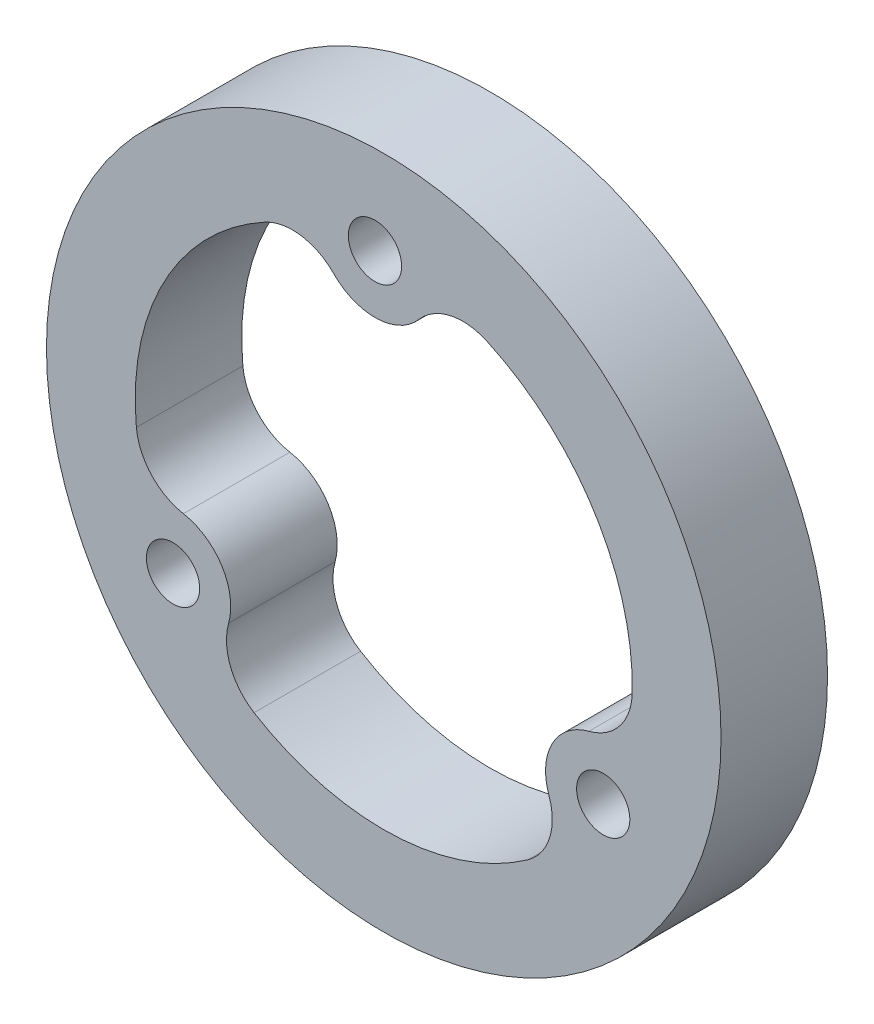
ISO-10303-21;
HEADER;
FILE_DESCRIPTION(('STEP AP214'),'2;1');
FILE_NAME('part.step','',(''),(''),'','','');
FILE_SCHEMA(('AUTOMOTIVE_DESIGN { 1 0 10303 214 1 1 1 1 }'));
ENDSEC;
DATA;
#1=APPLICATION_CONTEXT('core data for automotive mechanical design processes');
#2=APPLICATION_PROTOCOL_DEFINITION('international standard','automotive_design',2000,#1);
#3=PRODUCT_CONTEXT('',#1,'mechanical');
#4=PRODUCT('Part','Part','',(#3));
#5=PRODUCT_RELATED_PRODUCT_CATEGORY('part','',(#4));
#6=PRODUCT_DEFINITION_FORMATION('','',#4);
#7=PRODUCT_DEFINITION_CONTEXT('part definition',#1,'design');
#8=PRODUCT_DEFINITION('design','',#6,#7);
#9=PRODUCT_DEFINITION_SHAPE('','',#8);
#10=(LENGTH_UNIT() NAMED_UNIT(*) SI_UNIT(.MILLI.,.METRE.));
#11=(NAMED_UNIT(*) PLANE_ANGLE_UNIT() SI_UNIT($,.RADIAN.));
#12=(NAMED_UNIT(*) SI_UNIT($,.STERADIAN.) SOLID_ANGLE_UNIT());
#13=UNCERTAINTY_MEASURE_WITH_UNIT(LENGTH_MEASURE(1.E-05),#10,'distance_accuracy_value','');
#14=(GEOMETRIC_REPRESENTATION_CONTEXT(3) GLOBAL_UNCERTAINTY_ASSIGNED_CONTEXT((#13)) GLOBAL_UNIT_ASSIGNED_CONTEXT((#10,
#11,#12)) REPRESENTATION_CONTEXT('',''));
#15=CARTESIAN_POINT('',(0.,0.,0.));
#16=DIRECTION('',(0.,0.,1.));
#17=DIRECTION('',(1.,0.,0.));
#18=AXIS2_PLACEMENT_3D('',#15,#16,#17);
#19=CARTESIAN_POINT('',(0.,0.,6.));
#20=DIRECTION('',(0.,0.,1.));
#21=DIRECTION('',(1.,0.,0.));
#22=AXIS2_PLACEMENT_3D('',#19,#20,#21);
#23=PLANE('',#22);
#24=CARTESIAN_POINT('',(0.,0.,6.));
#25=DIRECTION('',(0.,0.,1.));
#26=DIRECTION('',(1.,0.,0.));
#27=AXIS2_PLACEMENT_3D('',#24,#25,#26);
#28=CIRCLE('',#27,14.);
#29=CARTESIAN_POINT('',(13.9955052642864,-0.354728624911595,6.));
#30=VERTEX_POINT('',#29);
#31=CARTESIAN_POINT('',(5.80690829075814,12.7389095335011,6.));
#32=VERTEX_POINT('',#31);
#33=EDGE_CURVE('E129',#30,#32,#28,.T.);
#34=ORIENTED_EDGE('',*,*,#33,.F.);
#35=CARTESIAN_POINT('',(10.7465486850771,-0.272380908414255,6.));
#36=DIRECTION('',(0.,0.,1.));
#37=DIRECTION('',(1.,0.,0.));
#38=AXIS2_PLACEMENT_3D('',#35,#36,#37);
#39=CIRCLE('',#38,3.25);
#40=CARTESIAN_POINT('',(11.5551312818012,-3.42018874630315,6.));
#41=VERTEX_POINT('',#40);
#42=EDGE_CURVE('E121',#41,#30,#39,.T.);
#43=ORIENTED_EDGE('',*,*,#42,.F.);
#44=CARTESIAN_POINT('',(12.3637138785254,-6.56799658419206,6.));
#45=DIRECTION('',(0.,0.,-1.));
#46=DIRECTION('',(1.,0.,0.));
#47=AXIS2_PLACEMENT_3D('',#44,#45,#46);
#48=CIRCLE('',#47,3.25);
#49=CARTESIAN_POINT('',(9.30272212200573,-7.66016390952212,6.));
#50=VERTEX_POINT('',#49);
#51=EDGE_CURVE('E164',#50,#41,#48,.T.);
#52=ORIENTED_EDGE('',*,*,#51,.F.);
#53=CARTESIAN_POINT('',(6.24173036548606,-8.75233123485219,6.));
#54=DIRECTION('',(0.,0.,1.));
#55=DIRECTION('',(1.,0.,0.));
#56=AXIS2_PLACEMENT_3D('',#53,#54,#55);
#57=CIRCLE('',#56,3.25);
#58=CARTESIAN_POINT('',(8.12876512714463,-11.3983848639936,6.));
#59=VERTEX_POINT('',#58);
#60=EDGE_CURVE('E162',#59,#50,#57,.T.);
#61=ORIENTED_EDGE('',*,*,#60,.F.);
#62=CARTESIAN_POINT('',(0.,0.,6.));
#63=DIRECTION('',(0.,0.,1.));
#64=DIRECTION('',(1.,0.,0.));
#65=AXIS2_PLACEMENT_3D('',#62,#63,#64);
#66=CIRCLE('',#65,14.);
#67=CARTESIAN_POINT('',(-7.30495663276615,-11.9430987852151,6.));
#68=VERTEX_POINT('',#67);
#69=EDGE_CURVE('E160',#68,#59,#66,.T.);
#70=ORIENTED_EDGE('',*,*,#69,.F.);
#71=CARTESIAN_POINT('',(-5.60916312873115,-9.17059371007586,6.));
#72=DIRECTION('',(0.,0.,1.));
#73=DIRECTION('',(1.,0.,0.));
#74=AXIS2_PLACEMENT_3D('',#71,#72,#73);
#75=CIRCLE('',#74,3.25);
#76=CARTESIAN_POINT('',(-8.73953598093679,-8.29694286095253,6.));
#77=VERTEX_POINT('',#76);
#78=EDGE_CURVE('E158',#77,#68,#75,.T.);
#79=ORIENTED_EDGE('',*,*,#78,.F.);
#80=CARTESIAN_POINT('',(-11.8699088331424,-7.4232920118292,6.));
#81=DIRECTION('',(0.,0.,-1.));
#82=DIRECTION('',(1.,0.,0.));
#83=AXIS2_PLACEMENT_3D('',#80,#81,#82);
#84=CIRCLE('',#83,3.25);
#85=CARTESIAN_POINT('',(-11.2852576038017,-4.22631172724338,6.));
#86=VERTEX_POINT('',#85);
#87=EDGE_CURVE('E156',#86,#77,#84,.T.);
#88=ORIENTED_EDGE('',*,*,#87,.F.);
#89=CARTESIAN_POINT('',(-10.7006063744611,-1.02933144265756,6.));
#90=DIRECTION('',(0.,0.,1.));
#91=DIRECTION('',(1.,0.,0.));
#92=AXIS2_PLACEMENT_3D('',#89,#90,#91);
#93=CIRCLE('',#92,3.25);
#94=CARTESIAN_POINT('',(-13.9356734179028,-1.34052466950752,6.));
#95=VERTEX_POINT('',#94);
#96=EDGE_CURVE('E154',#95,#86,#93,.T.);
#97=ORIENTED_EDGE('',*,*,#96,.F.);
#98=CARTESIAN_POINT('',(0.,0.,6.));
#99=DIRECTION('',(0.,0.,1.));
#100=DIRECTION('',(1.,0.,0.));
#101=AXIS2_PLACEMENT_3D('',#98,#99,#100);
#102=CIRCLE('',#101,14.);
#103=CARTESIAN_POINT('',(-6.69054863152024,12.2978274101267,6.));
#104=VERTEX_POINT('',#103);
#105=EDGE_CURVE('E152',#104,#95,#102,.T.);
#106=ORIENTED_EDGE('',*,*,#105,.F.);
#107=CARTESIAN_POINT('',(-5.1373855563459,9.44297461849011,6.));
#108=DIRECTION('',(0.,0.,1.));
#109=DIRECTION('',(1.,0.,0.));
#110=AXIS2_PLACEMENT_3D('',#107,#108,#109);
#111=CIRCLE('',#110,3.25);
#112=CARTESIAN_POINT('',(-2.81559530086442,11.7171316072557,6.));
#113=VERTEX_POINT('',#112);
#114=EDGE_CURVE('E150',#113,#104,#111,.T.);
#115=ORIENTED_EDGE('',*,*,#114,.F.);
#116=CARTESIAN_POINT('',(-0.493805045382954,13.9912885960213,6.));
#117=DIRECTION('',(0.,0.,-1.));
#118=DIRECTION('',(1.,0.,0.));
#119=AXIS2_PLACEMENT_3D('',#116,#117,#118);
#120=CIRCLE('',#119,3.25);
#121=CARTESIAN_POINT('',(1.98253548179602,11.8864756367655,6.));
#122=VERTEX_POINT('',#121);
#123=EDGE_CURVE('E145',#122,#113,#120,.T.);
#124=ORIENTED_EDGE('',*,*,#123,.F.);
#125=CARTESIAN_POINT('',(4.458876008975,9.78166267750975,6.));
#126=DIRECTION('',(0.,0.,1.));
#127=DIRECTION('',(1.,0.,0.));
#128=AXIS2_PLACEMENT_3D('',#125,#126,#127);
#129=CIRCLE('',#128,3.25);
#130=EDGE_CURVE('E143',#32,#122,#129,.T.);
#131=ORIENTED_EDGE('',*,*,#130,.F.);
#132=EDGE_LOOP('',(#34,#43,#52,#61,#70,#79,#88,#97,#106,#115,#124,#131));
#133=FACE_BOUND('',#132,.T.);
#134=CARTESIAN_POINT('',(12.3637138785254,-6.56799658419206,6.));
#135=DIRECTION('',(0.,0.,1.));
#136=DIRECTION('',(1.,0.,0.));
#137=AXIS2_PLACEMENT_3D('',#134,#135,#136);
#138=CIRCLE('',#137,1.50000000000007);
#139=CARTESIAN_POINT('',(13.8637138785255,-6.56799658419206,6.));
#140=VERTEX_POINT('',#139);
#141=EDGE_CURVE('E217',#140,#140,#138,.T.);
#142=ORIENTED_EDGE('',*,*,#141,.F.);
#143=EDGE_LOOP('',(#142));
#144=FACE_BOUND('',#143,.T.);
#145=CARTESIAN_POINT('',(0.,0.,6.));
#146=DIRECTION('',(0.,0.,1.));
#147=DIRECTION('',(1.,0.,0.));
#148=AXIS2_PLACEMENT_3D('',#145,#146,#147);
#149=CIRCLE('',#148,19.);
#150=CARTESIAN_POINT('',(19.,0.,6.));
#151=VERTEX_POINT('',#150);
#152=EDGE_CURVE('E11',#151,#151,#149,.T.);
#153=ORIENTED_EDGE('',*,*,#152,.T.);
#154=EDGE_LOOP('',(#153));
#155=FACE_BOUND('',#154,.T.);
#156=CARTESIAN_POINT('',(-0.493805045382954,13.9912885960213,6.));
#157=DIRECTION('',(0.,0.,1.));
#158=DIRECTION('',(1.,0.,0.));
#159=AXIS2_PLACEMENT_3D('',#156,#157,#158);
#160=CIRCLE('',#159,1.5);
#161=CARTESIAN_POINT('',(1.00619495461705,13.9912885960213,6.));
#162=VERTEX_POINT('',#161);
#163=EDGE_CURVE('E223',#162,#162,#160,.T.);
#164=ORIENTED_EDGE('',*,*,#163,.F.);
#165=EDGE_LOOP('',(#164));
#166=FACE_BOUND('',#165,.T.);
#167=CARTESIAN_POINT('',(-11.8699088331424,-7.4232920118292,6.));
#168=DIRECTION('',(0.,0.,1.));
#169=DIRECTION('',(1.,0.,0.));
#170=AXIS2_PLACEMENT_3D('',#167,#168,#169);
#171=CIRCLE('',#170,1.50000000000014);
#172=CARTESIAN_POINT('',(-10.3699088331423,-7.4232920118292,6.));
#173=VERTEX_POINT('',#172);
#174=EDGE_CURVE('E167',#173,#173,#171,.T.);
#175=ORIENTED_EDGE('',*,*,#174,.F.);
#176=EDGE_LOOP('',(#175));
#177=FACE_BOUND('',#176,.T.);
#178=ADVANCED_FACE('F32',(#133,#144,#155,#166,#177),#23,.T.);
#179=CARTESIAN_POINT('',(0.,0.,0.));
#180=DIRECTION('',(0.,0.,1.));
#181=DIRECTION('',(1.,0.,0.));
#182=AXIS2_PLACEMENT_3D('',#179,#180,#181);
#183=PLANE('',#182);
#184=CARTESIAN_POINT('',(12.3637138785254,-6.56799658419206,0.));
#185=DIRECTION('',(0.,0.,1.));
#186=DIRECTION('',(1.,0.,0.));
#187=AXIS2_PLACEMENT_3D('',#184,#185,#186);
#188=CIRCLE('',#187,1.50000000000007);
#189=CARTESIAN_POINT('',(13.8637138785255,-6.56799658419206,0.));
#190=VERTEX_POINT('',#189);
#191=EDGE_CURVE('E137',#190,#190,#188,.T.);
#192=ORIENTED_EDGE('',*,*,#191,.T.);
#193=EDGE_LOOP('',(#192));
#194=FACE_BOUND('',#193,.T.);
#195=CARTESIAN_POINT('',(-0.493805045382954,13.9912885960213,0.));
#196=DIRECTION('',(0.,0.,1.));
#197=DIRECTION('',(1.,0.,0.));
#198=AXIS2_PLACEMENT_3D('',#195,#196,#197);
#199=CIRCLE('',#198,1.5);
#200=CARTESIAN_POINT('',(1.00619495461705,13.9912885960213,0.));
#201=VERTEX_POINT('',#200);
#202=EDGE_CURVE('E220',#201,#201,#199,.T.);
#203=ORIENTED_EDGE('',*,*,#202,.T.);
#204=EDGE_LOOP('',(#203));
#205=FACE_BOUND('',#204,.T.);
#206=CARTESIAN_POINT('',(0.,0.,0.));
#207=DIRECTION('',(0.,0.,1.));
#208=DIRECTION('',(1.,0.,0.));
#209=AXIS2_PLACEMENT_3D('',#206,#207,#208);
#210=CIRCLE('',#209,19.);
#211=CARTESIAN_POINT('',(19.,0.,0.));
#212=VERTEX_POINT('',#211);
#213=EDGE_CURVE('E36',#212,#212,#210,.T.);
#214=ORIENTED_EDGE('',*,*,#213,.F.);
#215=EDGE_LOOP('',(#214));
#216=FACE_BOUND('',#215,.T.);
#217=CARTESIAN_POINT('',(10.7465486850771,-0.272380908414255,0.));
#218=DIRECTION('',(0.,0.,1.));
#219=DIRECTION('',(1.,0.,0.));
#220=AXIS2_PLACEMENT_3D('',#217,#218,#219);
#221=CIRCLE('',#220,3.25);
#222=CARTESIAN_POINT('',(11.5551312818012,-3.42018874630315,0.));
#223=VERTEX_POINT('',#222);
#224=CARTESIAN_POINT('',(13.9955052642864,-0.354728624911595,0.));
#225=VERTEX_POINT('',#224);
#226=EDGE_CURVE('E55',#223,#225,#221,.T.);
#227=ORIENTED_EDGE('',*,*,#226,.T.);
#228=CARTESIAN_POINT('',(0.,0.,0.));
#229=DIRECTION('',(0.,0.,1.));
#230=DIRECTION('',(1.,0.,0.));
#231=AXIS2_PLACEMENT_3D('',#228,#229,#230);
#232=CIRCLE('',#231,14.);
#233=CARTESIAN_POINT('',(5.80690829075814,12.7389095335011,0.));
#234=VERTEX_POINT('',#233);
#235=EDGE_CURVE('E136',#225,#234,#232,.T.);
#236=ORIENTED_EDGE('',*,*,#235,.T.);
#237=CARTESIAN_POINT('',(4.458876008975,9.78166267750975,0.));
#238=DIRECTION('',(0.,0.,1.));
#239=DIRECTION('',(1.,0.,0.));
#240=AXIS2_PLACEMENT_3D('',#237,#238,#239);
#241=CIRCLE('',#240,3.25);
#242=CARTESIAN_POINT('',(1.98253548179602,11.8864756367655,0.));
#243=VERTEX_POINT('',#242);
#244=EDGE_CURVE('E169',#234,#243,#241,.T.);
#245=ORIENTED_EDGE('',*,*,#244,.T.);
#246=CARTESIAN_POINT('',(-0.493805045382954,13.9912885960213,0.));
#247=DIRECTION('',(0.,0.,-1.));
#248=DIRECTION('',(1.,0.,0.));
#249=AXIS2_PLACEMENT_3D('',#246,#247,#248);
#250=CIRCLE('',#249,3.25);
#251=CARTESIAN_POINT('',(-2.81559530086442,11.7171316072557,0.));
#252=VERTEX_POINT('',#251);
#253=EDGE_CURVE('E172',#243,#252,#250,.T.);
#254=ORIENTED_EDGE('',*,*,#253,.T.);
#255=CARTESIAN_POINT('',(-5.1373855563459,9.44297461849011,0.));
#256=DIRECTION('',(0.,0.,1.));
#257=DIRECTION('',(1.,0.,0.));
#258=AXIS2_PLACEMENT_3D('',#255,#256,#257);
#259=CIRCLE('',#258,3.25);
#260=CARTESIAN_POINT('',(-6.69054863152024,12.2978274101267,0.));
#261=VERTEX_POINT('',#260);
#262=EDGE_CURVE('E175',#252,#261,#259,.T.);
#263=ORIENTED_EDGE('',*,*,#262,.T.);
#264=CARTESIAN_POINT('',(0.,0.,0.));
#265=DIRECTION('',(0.,0.,1.));
#266=DIRECTION('',(1.,0.,0.));
#267=AXIS2_PLACEMENT_3D('',#264,#265,#266);
#268=CIRCLE('',#267,14.);
#269=CARTESIAN_POINT('',(-13.9356734179028,-1.34052466950752,0.));
#270=VERTEX_POINT('',#269);
#271=EDGE_CURVE('E178',#261,#270,#268,.T.);
#272=ORIENTED_EDGE('',*,*,#271,.T.);
#273=CARTESIAN_POINT('',(-10.7006063744611,-1.02933144265756,0.));
#274=DIRECTION('',(0.,0.,1.));
#275=DIRECTION('',(1.,0.,0.));
#276=AXIS2_PLACEMENT_3D('',#273,#274,#275);
#277=CIRCLE('',#276,3.25);
#278=CARTESIAN_POINT('',(-11.2852576038017,-4.22631172724338,0.));
#279=VERTEX_POINT('',#278);
#280=EDGE_CURVE('E181',#270,#279,#277,.T.);
#281=ORIENTED_EDGE('',*,*,#280,.T.);
#282=CARTESIAN_POINT('',(-11.8699088331424,-7.4232920118292,0.));
#283=DIRECTION('',(0.,0.,-1.));
#284=DIRECTION('',(1.,0.,0.));
#285=AXIS2_PLACEMENT_3D('',#282,#283,#284);
#286=CIRCLE('',#285,3.25);
#287=CARTESIAN_POINT('',(-8.73953598093679,-8.29694286095253,0.));
#288=VERTEX_POINT('',#287);
#289=EDGE_CURVE('E184',#279,#288,#286,.T.);
#290=ORIENTED_EDGE('',*,*,#289,.T.);
#291=CARTESIAN_POINT('',(-5.60916312873115,-9.17059371007586,0.));
#292=DIRECTION('',(0.,0.,1.));
#293=DIRECTION('',(1.,0.,0.));
#294=AXIS2_PLACEMENT_3D('',#291,#292,#293);
#295=CIRCLE('',#294,3.25);
#296=CARTESIAN_POINT('',(-7.30495663276615,-11.9430987852151,0.));
#297=VERTEX_POINT('',#296);
#298=EDGE_CURVE('E187',#288,#297,#295,.T.);
#299=ORIENTED_EDGE('',*,*,#298,.T.);
#300=CARTESIAN_POINT('',(0.,0.,0.));
#301=DIRECTION('',(0.,0.,1.));
#302=DIRECTION('',(1.,0.,0.));
#303=AXIS2_PLACEMENT_3D('',#300,#301,#302);
#304=CIRCLE('',#303,14.);
#305=CARTESIAN_POINT('',(8.12876512714463,-11.3983848639936,0.));
#306=VERTEX_POINT('',#305);
#307=EDGE_CURVE('E190',#297,#306,#304,.T.);
#308=ORIENTED_EDGE('',*,*,#307,.T.);
#309=CARTESIAN_POINT('',(6.24173036548606,-8.75233123485219,0.));
#310=DIRECTION('',(0.,0.,1.));
#311=DIRECTION('',(1.,0.,0.));
#312=AXIS2_PLACEMENT_3D('',#309,#310,#311);
#313=CIRCLE('',#312,3.25);
#314=CARTESIAN_POINT('',(9.30272212200573,-7.66016390952212,0.));
#315=VERTEX_POINT('',#314);
#316=EDGE_CURVE('E193',#306,#315,#313,.T.);
#317=ORIENTED_EDGE('',*,*,#316,.T.);
#318=CARTESIAN_POINT('',(12.3637138785254,-6.56799658419206,0.));
#319=DIRECTION('',(0.,0.,-1.));
#320=DIRECTION('',(1.,0.,0.));
#321=AXIS2_PLACEMENT_3D('',#318,#319,#320);
#322=CIRCLE('',#321,3.25);
#323=EDGE_CURVE('E130',#315,#223,#322,.T.);
#324=ORIENTED_EDGE('',*,*,#323,.T.);
#325=EDGE_LOOP('',(#227,#236,#245,#254,#263,#272,#281,#290,#299,#308,#317,#324));
#326=FACE_BOUND('',#325,.T.);
#327=CARTESIAN_POINT('',(-11.8699088331424,-7.4232920118292,0.));
#328=DIRECTION('',(0.,0.,1.));
#329=DIRECTION('',(1.,0.,0.));
#330=AXIS2_PLACEMENT_3D('',#327,#328,#329);
#331=CIRCLE('',#330,1.50000000000014);
#332=CARTESIAN_POINT('',(-10.3699088331423,-7.4232920118292,0.));
#333=VERTEX_POINT('',#332);
#334=EDGE_CURVE('E402',#333,#333,#331,.T.);
#335=ORIENTED_EDGE('',*,*,#334,.T.);
#336=EDGE_LOOP('',(#335));
#337=FACE_BOUND('',#336,.T.);
#338=ADVANCED_FACE('F229',(#194,#205,#216,#326,#337),#183,.F.);
#339=CARTESIAN_POINT('',(0.,0.,6.));
#340=DIRECTION('',(0.,0.,-1.));
#341=DIRECTION('',(-1.,0.,0.));
#342=AXIS2_PLACEMENT_3D('',#339,#340,#341);
#343=CYLINDRICAL_SURFACE('',#342,19.);
#344=ORIENTED_EDGE('',*,*,#152,.F.);
#345=EDGE_LOOP('',(#344));
#346=FACE_BOUND('',#345,.T.);
#347=ORIENTED_EDGE('',*,*,#213,.T.);
#348=EDGE_LOOP('',(#347));
#349=FACE_BOUND('',#348,.T.);
#350=ADVANCED_FACE('F34',(#346,#349),#343,.T.);
#351=CARTESIAN_POINT('',(-0.493805045382954,13.9912885960213,6.));
#352=DIRECTION('',(0.,0.,-1.));
#353=DIRECTION('',(-1.,0.,0.));
#354=AXIS2_PLACEMENT_3D('',#351,#352,#353);
#355=CYLINDRICAL_SURFACE('',#354,1.5);
#356=ORIENTED_EDGE('',*,*,#163,.T.);
#357=EDGE_LOOP('',(#356));
#358=FACE_BOUND('',#357,.T.);
#359=ORIENTED_EDGE('',*,*,#202,.F.);
#360=EDGE_LOOP('',(#359));
#361=FACE_BOUND('',#360,.T.);
#362=ADVANCED_FACE('F232',(#358,#361),#355,.F.);
#363=CARTESIAN_POINT('',(12.3637138785254,-6.56799658419206,6.));
#364=DIRECTION('',(0.,0.,-1.));
#365=DIRECTION('',(-1.,0.,0.));
#366=AXIS2_PLACEMENT_3D('',#363,#364,#365);
#367=CYLINDRICAL_SURFACE('',#366,1.50000000000007);
#368=ORIENTED_EDGE('',*,*,#141,.T.);
#369=EDGE_LOOP('',(#368));
#370=FACE_BOUND('',#369,.T.);
#371=ORIENTED_EDGE('',*,*,#191,.F.);
#372=EDGE_LOOP('',(#371));
#373=FACE_BOUND('',#372,.T.);
#374=ADVANCED_FACE('F234',(#370,#373),#367,.F.);
#375=CARTESIAN_POINT('',(10.7465486850771,-0.272380908414255,6.));
#376=DIRECTION('',(0.,0.,-1.));
#377=DIRECTION('',(-1.,0.,0.));
#378=AXIS2_PLACEMENT_3D('',#375,#376,#377);
#379=CYLINDRICAL_SURFACE('',#378,3.25);
#380=ORIENTED_EDGE('',*,*,#226,.F.);
#381=DIRECTION('',(0.,0.,-1.));
#382=VECTOR('',#381,1.);
#383=CARTESIAN_POINT('',(11.5551312818012,-3.42018874630315,6.));
#384=LINE('',#383,#382);
#385=EDGE_CURVE('E125',#41,#223,#384,.T.);
#386=ORIENTED_EDGE('',*,*,#385,.F.);
#387=ORIENTED_EDGE('',*,*,#42,.T.);
#388=DIRECTION('',(0.,0.,-1.));
#389=VECTOR('',#388,1.);
#390=CARTESIAN_POINT('',(13.9955052642864,-0.354728624911595,6.));
#391=LINE('',#390,#389);
#392=EDGE_CURVE('E124',#30,#225,#391,.T.);
#393=ORIENTED_EDGE('',*,*,#392,.T.);
#394=EDGE_LOOP('',(#380,#386,#387,#393));
#395=FACE_BOUND('',#394,.T.);
#396=ADVANCED_FACE('F123',(#395),#379,.F.);
#397=CARTESIAN_POINT('',(0.,0.,6.));
#398=DIRECTION('',(0.,0.,-1.));
#399=DIRECTION('',(-1.,0.,0.));
#400=AXIS2_PLACEMENT_3D('',#397,#398,#399);
#401=CYLINDRICAL_SURFACE('',#400,14.);
#402=ORIENTED_EDGE('',*,*,#235,.F.);
#403=ORIENTED_EDGE('',*,*,#392,.F.);
#404=ORIENTED_EDGE('',*,*,#33,.T.);
#405=DIRECTION('',(0.,0.,-1.));
#406=VECTOR('',#405,1.);
#407=CARTESIAN_POINT('',(5.80690829075814,12.7389095335011,6.));
#408=LINE('',#407,#406);
#409=EDGE_CURVE('E138',#32,#234,#408,.T.);
#410=ORIENTED_EDGE('',*,*,#409,.T.);
#411=EDGE_LOOP('',(#402,#403,#404,#410));
#412=FACE_BOUND('',#411,.T.);
#413=ADVANCED_FACE('F133',(#412),#401,.F.);
#414=CARTESIAN_POINT('',(4.458876008975,9.78166267750975,6.));
#415=DIRECTION('',(0.,0.,-1.));
#416=DIRECTION('',(-1.,0.,0.));
#417=AXIS2_PLACEMENT_3D('',#414,#415,#416);
#418=CYLINDRICAL_SURFACE('',#417,3.25);
#419=ORIENTED_EDGE('',*,*,#244,.F.);
#420=ORIENTED_EDGE('',*,*,#409,.F.);
#421=ORIENTED_EDGE('',*,*,#130,.T.);
#422=DIRECTION('',(0.,0.,-1.));
#423=VECTOR('',#422,1.);
#424=CARTESIAN_POINT('',(1.98253548179602,11.8864756367655,6.));
#425=LINE('',#424,#423);
#426=EDGE_CURVE('E214',#122,#243,#425,.T.);
#427=ORIENTED_EDGE('',*,*,#426,.T.);
#428=EDGE_LOOP('',(#419,#420,#421,#427));
#429=FACE_BOUND('',#428,.T.);
#430=ADVANCED_FACE('F285',(#429),#418,.F.);
#431=CARTESIAN_POINT('',(-0.493805045382954,13.9912885960213,6.));
#432=DIRECTION('',(0.,0.,-1.));
#433=DIRECTION('',(-1.,0.,0.));
#434=AXIS2_PLACEMENT_3D('',#431,#432,#433);
#435=CYLINDRICAL_SURFACE('',#434,3.25);
#436=ORIENTED_EDGE('',*,*,#253,.F.);
#437=ORIENTED_EDGE('',*,*,#426,.F.);
#438=ORIENTED_EDGE('',*,*,#123,.T.);
#439=DIRECTION('',(0.,0.,-1.));
#440=VECTOR('',#439,1.);
#441=CARTESIAN_POINT('',(-2.81559530086442,11.7171316072557,6.));
#442=LINE('',#441,#440);
#443=EDGE_CURVE('E212',#113,#252,#442,.T.);
#444=ORIENTED_EDGE('',*,*,#443,.T.);
#445=EDGE_LOOP('',(#436,#437,#438,#444));
#446=FACE_BOUND('',#445,.T.);
#447=ADVANCED_FACE('F294',(#446),#435,.T.);
#448=CARTESIAN_POINT('',(-5.1373855563459,9.44297461849011,6.));
#449=DIRECTION('',(0.,0.,-1.));
#450=DIRECTION('',(-1.,0.,0.));
#451=AXIS2_PLACEMENT_3D('',#448,#449,#450);
#452=CYLINDRICAL_SURFACE('',#451,3.25);
#453=ORIENTED_EDGE('',*,*,#262,.F.);
#454=ORIENTED_EDGE('',*,*,#443,.F.);
#455=ORIENTED_EDGE('',*,*,#114,.T.);
#456=DIRECTION('',(0.,0.,-1.));
#457=VECTOR('',#456,1.);
#458=CARTESIAN_POINT('',(-6.69054863152024,12.2978274101267,6.));
#459=LINE('',#458,#457);
#460=EDGE_CURVE('E210',#104,#261,#459,.T.);
#461=ORIENTED_EDGE('',*,*,#460,.T.);
#462=EDGE_LOOP('',(#453,#454,#455,#461));
#463=FACE_BOUND('',#462,.T.);
#464=ADVANCED_FACE('F304',(#463),#452,.F.);
#465=CARTESIAN_POINT('',(0.,0.,6.));
#466=DIRECTION('',(0.,0.,-1.));
#467=DIRECTION('',(-1.,0.,0.));
#468=AXIS2_PLACEMENT_3D('',#465,#466,#467);
#469=CYLINDRICAL_SURFACE('',#468,14.);
#470=ORIENTED_EDGE('',*,*,#271,.F.);
#471=ORIENTED_EDGE('',*,*,#460,.F.);
#472=ORIENTED_EDGE('',*,*,#105,.T.);
#473=DIRECTION('',(0.,0.,-1.));
#474=VECTOR('',#473,1.);
#475=CARTESIAN_POINT('',(-13.9356734179028,-1.34052466950752,6.));
#476=LINE('',#475,#474);
#477=EDGE_CURVE('E208',#95,#270,#476,.T.);
#478=ORIENTED_EDGE('',*,*,#477,.T.);
#479=EDGE_LOOP('',(#470,#471,#472,#478));
#480=FACE_BOUND('',#479,.T.);
#481=ADVANCED_FACE('F314',(#480),#469,.F.);
#482=CARTESIAN_POINT('',(-10.7006063744611,-1.02933144265756,6.));
#483=DIRECTION('',(0.,0.,-1.));
#484=DIRECTION('',(-1.,0.,0.));
#485=AXIS2_PLACEMENT_3D('',#482,#483,#484);
#486=CYLINDRICAL_SURFACE('',#485,3.25);
#487=ORIENTED_EDGE('',*,*,#280,.F.);
#488=ORIENTED_EDGE('',*,*,#477,.F.);
#489=ORIENTED_EDGE('',*,*,#96,.T.);
#490=DIRECTION('',(0.,0.,-1.));
#491=VECTOR('',#490,1.);
#492=CARTESIAN_POINT('',(-11.2852576038017,-4.22631172724338,6.));
#493=LINE('',#492,#491);
#494=EDGE_CURVE('E206',#86,#279,#493,.T.);
#495=ORIENTED_EDGE('',*,*,#494,.T.);
#496=EDGE_LOOP('',(#487,#488,#489,#495));
#497=FACE_BOUND('',#496,.T.);
#498=ADVANCED_FACE('F324',(#497),#486,.F.);
#499=CARTESIAN_POINT('',(-11.8699088331424,-7.4232920118292,6.));
#500=DIRECTION('',(0.,0.,-1.));
#501=DIRECTION('',(-1.,0.,0.));
#502=AXIS2_PLACEMENT_3D('',#499,#500,#501);
#503=CYLINDRICAL_SURFACE('',#502,3.25);
#504=ORIENTED_EDGE('',*,*,#289,.F.);
#505=ORIENTED_EDGE('',*,*,#494,.F.);
#506=ORIENTED_EDGE('',*,*,#87,.T.);
#507=DIRECTION('',(0.,0.,-1.));
#508=VECTOR('',#507,1.);
#509=CARTESIAN_POINT('',(-8.73953598093679,-8.29694286095253,6.));
#510=LINE('',#509,#508);
#511=EDGE_CURVE('E204',#77,#288,#510,.T.);
#512=ORIENTED_EDGE('',*,*,#511,.T.);
#513=EDGE_LOOP('',(#504,#505,#506,#512));
#514=FACE_BOUND('',#513,.T.);
#515=ADVANCED_FACE('F334',(#514),#503,.T.);
#516=CARTESIAN_POINT('',(-5.60916312873115,-9.17059371007586,6.));
#517=DIRECTION('',(0.,0.,-1.));
#518=DIRECTION('',(-1.,0.,0.));
#519=AXIS2_PLACEMENT_3D('',#516,#517,#518);
#520=CYLINDRICAL_SURFACE('',#519,3.25);
#521=ORIENTED_EDGE('',*,*,#298,.F.);
#522=ORIENTED_EDGE('',*,*,#511,.F.);
#523=ORIENTED_EDGE('',*,*,#78,.T.);
#524=DIRECTION('',(0.,0.,-1.));
#525=VECTOR('',#524,1.);
#526=CARTESIAN_POINT('',(-7.30495663276615,-11.9430987852151,6.));
#527=LINE('',#526,#525);
#528=EDGE_CURVE('E202',#68,#297,#527,.T.);
#529=ORIENTED_EDGE('',*,*,#528,.T.);
#530=EDGE_LOOP('',(#521,#522,#523,#529));
#531=FACE_BOUND('',#530,.T.);
#532=ADVANCED_FACE('F344',(#531),#520,.F.);
#533=CARTESIAN_POINT('',(0.,0.,6.));
#534=DIRECTION('',(0.,0.,-1.));
#535=DIRECTION('',(-1.,0.,0.));
#536=AXIS2_PLACEMENT_3D('',#533,#534,#535);
#537=CYLINDRICAL_SURFACE('',#536,14.);
#538=ORIENTED_EDGE('',*,*,#307,.F.);
#539=ORIENTED_EDGE('',*,*,#528,.F.);
#540=ORIENTED_EDGE('',*,*,#69,.T.);
#541=DIRECTION('',(0.,0.,-1.));
#542=VECTOR('',#541,1.);
#543=CARTESIAN_POINT('',(8.12876512714463,-11.3983848639936,6.));
#544=LINE('',#543,#542);
#545=EDGE_CURVE('E200',#59,#306,#544,.T.);
#546=ORIENTED_EDGE('',*,*,#545,.T.);
#547=EDGE_LOOP('',(#538,#539,#540,#546));
#548=FACE_BOUND('',#547,.T.);
#549=ADVANCED_FACE('F354',(#548),#537,.F.);
#550=CARTESIAN_POINT('',(6.24173036548606,-8.75233123485219,6.));
#551=DIRECTION('',(0.,0.,-1.));
#552=DIRECTION('',(-1.,0.,0.));
#553=AXIS2_PLACEMENT_3D('',#550,#551,#552);
#554=CYLINDRICAL_SURFACE('',#553,3.25);
#555=ORIENTED_EDGE('',*,*,#316,.F.);
#556=ORIENTED_EDGE('',*,*,#545,.F.);
#557=ORIENTED_EDGE('',*,*,#60,.T.);
#558=DIRECTION('',(0.,0.,-1.));
#559=VECTOR('',#558,1.);
#560=CARTESIAN_POINT('',(9.30272212200573,-7.66016390952212,6.));
#561=LINE('',#560,#559);
#562=EDGE_CURVE('E47',#50,#315,#561,.T.);
#563=ORIENTED_EDGE('',*,*,#562,.T.);
#564=EDGE_LOOP('',(#555,#556,#557,#563));
#565=FACE_BOUND('',#564,.T.);
#566=ADVANCED_FACE('F364',(#565),#554,.F.);
#567=CARTESIAN_POINT('',(12.3637138785254,-6.56799658419206,6.));
#568=DIRECTION('',(0.,0.,-1.));
#569=DIRECTION('',(-1.,0.,0.));
#570=AXIS2_PLACEMENT_3D('',#567,#568,#569);
#571=CYLINDRICAL_SURFACE('',#570,3.25);
#572=ORIENTED_EDGE('',*,*,#323,.F.);
#573=ORIENTED_EDGE('',*,*,#562,.F.);
#574=ORIENTED_EDGE('',*,*,#51,.T.);
#575=ORIENTED_EDGE('',*,*,#385,.T.);
#576=EDGE_LOOP('',(#572,#573,#574,#575));
#577=FACE_BOUND('',#576,.T.);
#578=ADVANCED_FACE('F374',(#577),#571,.T.);
#579=CARTESIAN_POINT('',(-11.8699088331424,-7.4232920118292,6.));
#580=DIRECTION('',(0.,0.,-1.));
#581=DIRECTION('',(-1.,0.,0.));
#582=AXIS2_PLACEMENT_3D('',#579,#580,#581);
#583=CYLINDRICAL_SURFACE('',#582,1.50000000000014);
#584=ORIENTED_EDGE('',*,*,#174,.T.);
#585=EDGE_LOOP('',(#584));
#586=FACE_BOUND('',#585,.T.);
#587=ORIENTED_EDGE('',*,*,#334,.F.);
#588=EDGE_LOOP('',(#587));
#589=FACE_BOUND('',#588,.T.);
#590=ADVANCED_FACE('F384',(#586,#589),#583,.F.);
#591=CLOSED_SHELL('',(#178,#338,#350,#362,#374,#396,#413,#430,#447,#464,#481,#498,#515,#532,
#549,#566,#578,#590));
#592=MANIFOLD_SOLID_BREP('B2',#591);
#593=ADVANCED_BREP_SHAPE_REPRESENTATION('',(#18,#592),#14);
#594=SHAPE_DEFINITION_REPRESENTATION(#9,#593);
ENDSEC;
END-ISO-10303-21;
